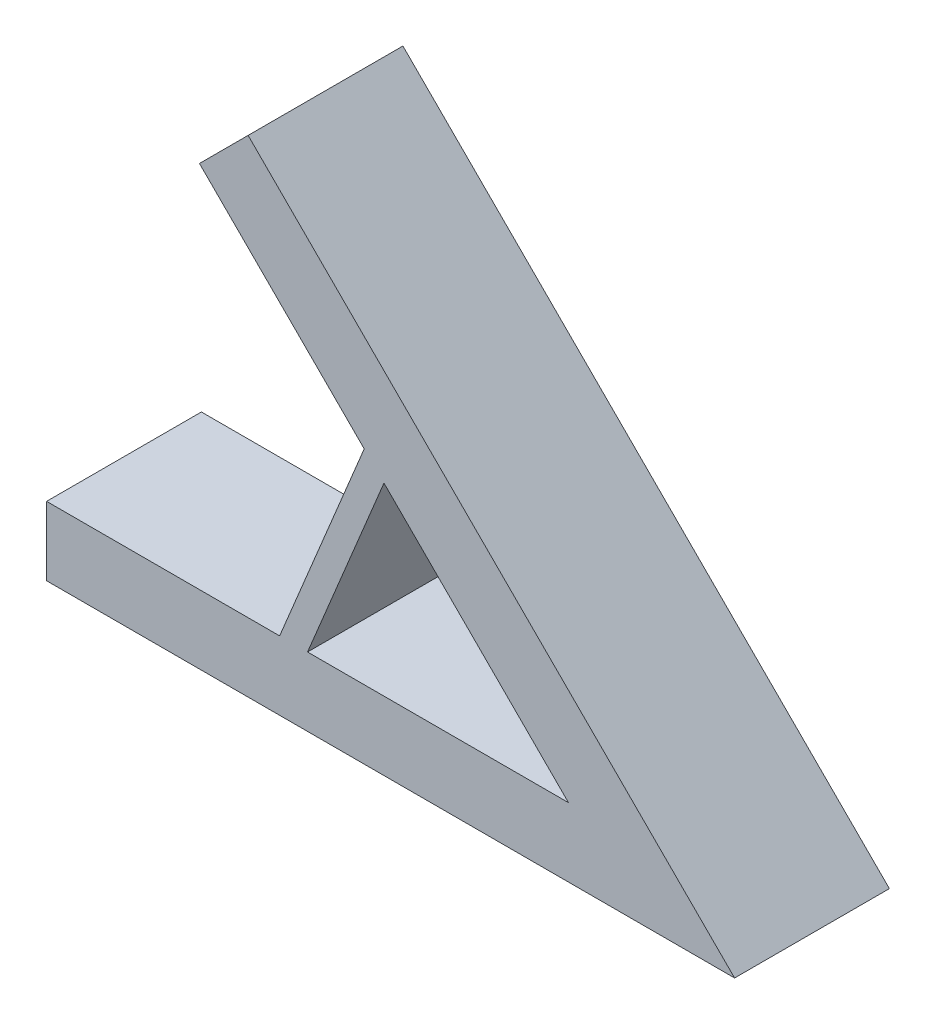
ISO-10303-21;
HEADER;
FILE_DESCRIPTION(('STEP AP214'),'2;1');
FILE_NAME('part.step','',(''),(''),'','','');
FILE_SCHEMA(('AUTOMOTIVE_DESIGN { 1 0 10303 214 1 1 1 1 }'));
ENDSEC;
DATA;
#1=APPLICATION_CONTEXT('core data for automotive mechanical design processes');
#2=APPLICATION_PROTOCOL_DEFINITION('international standard','automotive_design',2000,#1);
#3=PRODUCT_CONTEXT('',#1,'mechanical');
#4=PRODUCT('Part','Part','',(#3));
#5=PRODUCT_RELATED_PRODUCT_CATEGORY('part','',(#4));
#6=PRODUCT_DEFINITION_FORMATION('','',#4);
#7=PRODUCT_DEFINITION_CONTEXT('part definition',#1,'design');
#8=PRODUCT_DEFINITION('design','',#6,#7);
#9=PRODUCT_DEFINITION_SHAPE('','',#8);
#10=(LENGTH_UNIT() NAMED_UNIT(*) SI_UNIT(.MILLI.,.METRE.));
#11=(NAMED_UNIT(*) PLANE_ANGLE_UNIT() SI_UNIT($,.RADIAN.));
#12=(NAMED_UNIT(*) SI_UNIT($,.STERADIAN.) SOLID_ANGLE_UNIT());
#13=UNCERTAINTY_MEASURE_WITH_UNIT(LENGTH_MEASURE(1.E-05),#10,'distance_accuracy_value','');
#14=(GEOMETRIC_REPRESENTATION_CONTEXT(3) GLOBAL_UNCERTAINTY_ASSIGNED_CONTEXT((#13)) GLOBAL_UNIT_ASSIGNED_CONTEXT((#10,
#11,#12)) REPRESENTATION_CONTEXT('',''));
#15=CARTESIAN_POINT('',(0.,0.,0.));
#16=DIRECTION('',(0.,0.,1.));
#17=DIRECTION('',(1.,0.,0.));
#18=AXIS2_PLACEMENT_3D('',#15,#16,#17);
#19=CARTESIAN_POINT('',(0.,8.00000000000001,18.));
#20=DIRECTION('',(0.,-1.,0.));
#21=DIRECTION('',(1.,0.,0.));
#22=AXIS2_PLACEMENT_3D('',#19,#20,#21);
#23=PLANE('',#22);
#24=DIRECTION('',(-1.,0.,0.));
#25=VECTOR('',#24,1.);
#26=CARTESIAN_POINT('',(0.,8.00000000000001,0.));
#27=LINE('',#26,#25);
#28=CARTESIAN_POINT('',(-19.3137084989849,8.00000000000002,0.));
#29=VERTEX_POINT('',#28);
#30=CARTESIAN_POINT('',(-49.6568542494924,8.00000000000001,0.));
#31=VERTEX_POINT('',#30);
#32=EDGE_CURVE('E134',#29,#31,#27,.T.);
#33=ORIENTED_EDGE('',*,*,#32,.T.);
#34=DIRECTION('',(0.,0.,-1.));
#35=VECTOR('',#34,1.);
#36=CARTESIAN_POINT('',(-49.6568542494924,8.00000000000001,18.));
#37=LINE('',#36,#35);
#38=CARTESIAN_POINT('',(-49.6568542494924,8.00000000000001,18.));
#39=VERTEX_POINT('',#38);
#40=EDGE_CURVE('E11',#39,#31,#37,.T.);
#41=ORIENTED_EDGE('',*,*,#40,.F.);
#42=DIRECTION('',(-1.,0.,0.));
#43=VECTOR('',#42,1.);
#44=CARTESIAN_POINT('',(0.,8.00000000000001,18.));
#45=LINE('',#44,#43);
#46=CARTESIAN_POINT('',(-19.3137084989849,8.00000000000002,18.));
#47=VERTEX_POINT('',#46);
#48=EDGE_CURVE('E126',#47,#39,#45,.T.);
#49=ORIENTED_EDGE('',*,*,#48,.F.);
#50=DIRECTION('',(0.,0.,-1.));
#51=VECTOR('',#50,1.);
#52=CARTESIAN_POINT('',(-19.3137084989849,8.00000000000002,18.));
#53=LINE('',#52,#51);
#54=EDGE_CURVE('E135',#47,#29,#53,.T.);
#55=ORIENTED_EDGE('',*,*,#54,.T.);
#56=EDGE_LOOP('',(#33,#41,#49,#55));
#57=FACE_BOUND('',#56,.T.);
#58=ADVANCED_FACE('F36',(#57),#23,.F.);
#59=CARTESIAN_POINT('',(-45.2132034355966,18.7279220613578,18.));
#60=DIRECTION('',(-0.923879532511288,0.382683432365087,0.));
#61=DIRECTION('',(-0.382683432365087,-0.923879532511288,0.));
#62=AXIS2_PLACEMENT_3D('',#59,#60,#61);
#63=PLANE('',#62);
#64=DIRECTION('',(0.382683432365087,0.923879532511288,0.));
#65=VECTOR('',#64,1.);
#66=CARTESIAN_POINT('',(-45.2132034355966,18.7279220613578,0.));
#67=LINE('',#66,#65);
#68=CARTESIAN_POINT('',(-40.7695526217007,29.4558441227155,0.));
#69=VERTEX_POINT('',#68);
#70=EDGE_CURVE('E88',#31,#69,#67,.T.);
#71=ORIENTED_EDGE('',*,*,#70,.T.);
#72=DIRECTION('',(0.,0.,-1.));
#73=VECTOR('',#72,1.);
#74=CARTESIAN_POINT('',(-40.7695526217007,29.4558441227155,18.));
#75=LINE('',#74,#73);
#76=CARTESIAN_POINT('',(-40.7695526217007,29.4558441227155,18.));
#77=VERTEX_POINT('',#76);
#78=EDGE_CURVE('E46',#77,#69,#75,.T.);
#79=ORIENTED_EDGE('',*,*,#78,.F.);
#80=DIRECTION('',(0.382683432365087,0.923879532511288,0.));
#81=VECTOR('',#80,1.);
#82=CARTESIAN_POINT('',(-45.2132034355966,18.7279220613578,18.));
#83=LINE('',#82,#81);
#84=EDGE_CURVE('E122',#39,#77,#83,.T.);
#85=ORIENTED_EDGE('',*,*,#84,.F.);
#86=ORIENTED_EDGE('',*,*,#40,.T.);
#87=EDGE_LOOP('',(#71,#79,#85,#86));
#88=FACE_BOUND('',#87,.T.);
#89=ADVANCED_FACE('F123',(#88),#63,.F.);
#90=CARTESIAN_POINT('',(-47.9848420331304,19.875972358453,18.));
#91=DIRECTION('',(0.923879532511288,-0.382683432365087,0.));
#92=DIRECTION('',(0.382683432365087,0.923879532511288,0.));
#93=AXIS2_PLACEMENT_3D('',#90,#91,#92);
#94=PLANE('',#93);
#95=DIRECTION('',(-0.382683432365087,-0.923879532511288,0.));
#96=VECTOR('',#95,1.);
#97=CARTESIAN_POINT('',(-47.9848420331304,19.875972358453,0.));
#98=LINE('',#97,#96);
#99=CARTESIAN_POINT('',(-43.0656532158912,31.7519447169061,0.));
#100=VERTEX_POINT('',#99);
#101=CARTESIAN_POINT('',(-52.9040308503696,8.00000000000001,0.));
#102=VERTEX_POINT('',#101);
#103=EDGE_CURVE('E146',#100,#102,#98,.T.);
#104=ORIENTED_EDGE('',*,*,#103,.T.);
#105=DIRECTION('',(0.,0.,-1.));
#106=VECTOR('',#105,1.);
#107=CARTESIAN_POINT('',(-52.9040308503696,8.00000000000001,18.));
#108=LINE('',#107,#106);
#109=CARTESIAN_POINT('',(-52.9040308503696,8.00000000000001,18.));
#110=VERTEX_POINT('',#109);
#111=EDGE_CURVE('E40',#110,#102,#108,.T.);
#112=ORIENTED_EDGE('',*,*,#111,.F.);
#113=DIRECTION('',(-0.382683432365087,-0.923879532511288,0.));
#114=VECTOR('',#113,1.);
#115=CARTESIAN_POINT('',(-47.9848420331304,19.875972358453,18.));
#116=LINE('',#115,#114);
#117=CARTESIAN_POINT('',(-43.0656532158912,31.7519447169061,18.));
#118=VERTEX_POINT('',#117);
#119=EDGE_CURVE('E164',#118,#110,#116,.T.);
#120=ORIENTED_EDGE('',*,*,#119,.F.);
#121=DIRECTION('',(0.,0.,-1.));
#122=VECTOR('',#121,1.);
#123=CARTESIAN_POINT('',(-43.0656532158912,31.7519447169061,18.));
#124=LINE('',#123,#122);
#125=EDGE_CURVE('E172',#118,#100,#124,.T.);
#126=ORIENTED_EDGE('',*,*,#125,.T.);
#127=EDGE_LOOP('',(#104,#112,#120,#126));
#128=FACE_BOUND('',#127,.T.);
#129=ADVANCED_FACE('F38',(#128),#94,.F.);
#130=CARTESIAN_POINT('',(-80.,8.,0.));
#131=VERTEX_POINT('',#130);
#132=EDGE_CURVE('E139',#102,#131,#27,.T.);
#133=ORIENTED_EDGE('',*,*,#132,.T.);
#134=DIRECTION('',(0.,0.,-1.));
#135=VECTOR('',#134,1.);
#136=CARTESIAN_POINT('',(-80.,8.,18.));
#137=LINE('',#136,#135);
#138=CARTESIAN_POINT('',(-80.,8.,18.));
#139=VERTEX_POINT('',#138);
#140=EDGE_CURVE('E185',#139,#131,#137,.T.);
#141=ORIENTED_EDGE('',*,*,#140,.F.);
#142=EDGE_CURVE('E103',#110,#139,#45,.T.);
#143=ORIENTED_EDGE('',*,*,#142,.F.);
#144=ORIENTED_EDGE('',*,*,#111,.T.);
#145=EDGE_LOOP('',(#133,#141,#143,#144));
#146=FACE_BOUND('',#145,.T.);
#147=ADVANCED_FACE('F189',(#146),#23,.F.);
#148=CARTESIAN_POINT('',(-80.,0.,18.));
#149=DIRECTION('',(1.,0.,0.));
#150=DIRECTION('',(0.,0.,-1.));
#151=AXIS2_PLACEMENT_3D('',#148,#149,#150);
#152=PLANE('',#151);
#153=DIRECTION('',(0.,-1.,0.));
#154=VECTOR('',#153,1.);
#155=CARTESIAN_POINT('',(-80.,0.,0.));
#156=LINE('',#155,#154);
#157=CARTESIAN_POINT('',(-80.,0.,0.));
#158=VERTEX_POINT('',#157);
#159=EDGE_CURVE('E145',#131,#158,#156,.T.);
#160=ORIENTED_EDGE('',*,*,#159,.T.);
#161=DIRECTION('',(0.,0.,-1.));
#162=VECTOR('',#161,1.);
#163=CARTESIAN_POINT('',(-80.,0.,18.));
#164=LINE('',#163,#162);
#165=CARTESIAN_POINT('',(-80.,0.,18.));
#166=VERTEX_POINT('',#165);
#167=EDGE_CURVE('E183',#166,#158,#164,.T.);
#168=ORIENTED_EDGE('',*,*,#167,.F.);
#169=DIRECTION('',(0.,-1.,0.));
#170=VECTOR('',#169,1.);
#171=CARTESIAN_POINT('',(-80.,0.,18.));
#172=LINE('',#171,#170);
#173=EDGE_CURVE('E162',#139,#166,#172,.T.);
#174=ORIENTED_EDGE('',*,*,#173,.F.);
#175=ORIENTED_EDGE('',*,*,#140,.T.);
#176=EDGE_LOOP('',(#160,#168,#174,#175));
#177=FACE_BOUND('',#176,.T.);
#178=ADVANCED_FACE('F200',(#177),#152,.F.);
#179=CARTESIAN_POINT('',(0.,0.,18.));
#180=DIRECTION('',(0.,1.,0.));
#181=DIRECTION('',(0.,0.,1.));
#182=AXIS2_PLACEMENT_3D('',#179,#180,#181);
#183=PLANE('',#182);
#184=DIRECTION('',(1.,0.,0.));
#185=VECTOR('',#184,1.);
#186=CARTESIAN_POINT('',(0.,0.,0.));
#187=LINE('',#186,#185);
#188=CARTESIAN_POINT('',(0.,0.,0.));
#189=VERTEX_POINT('',#188);
#190=EDGE_CURVE('E148',#158,#189,#187,.T.);
#191=ORIENTED_EDGE('',*,*,#190,.T.);
#192=DIRECTION('',(0.,0.,-1.));
#193=VECTOR('',#192,1.);
#194=CARTESIAN_POINT('',(0.,0.,18.));
#195=LINE('',#194,#193);
#196=CARTESIAN_POINT('',(0.,0.,18.));
#197=VERTEX_POINT('',#196);
#198=EDGE_CURVE('E180',#197,#189,#195,.T.);
#199=ORIENTED_EDGE('',*,*,#198,.F.);
#200=DIRECTION('',(1.,0.,0.));
#201=VECTOR('',#200,1.);
#202=CARTESIAN_POINT('',(0.,0.,18.));
#203=LINE('',#202,#201);
#204=EDGE_CURVE('E160',#166,#197,#203,.T.);
#205=ORIENTED_EDGE('',*,*,#204,.F.);
#206=ORIENTED_EDGE('',*,*,#167,.T.);
#207=EDGE_LOOP('',(#191,#199,#205,#206));
#208=FACE_BOUND('',#207,.T.);
#209=ADVANCED_FACE('F203',(#208),#183,.F.);
#210=CARTESIAN_POINT('',(0.,0.,18.));
#211=DIRECTION('',(-0.707106781186544,-0.707106781186551,0.));
#212=DIRECTION('',(0.707106781186551,-0.707106781186544,0.));
#213=AXIS2_PLACEMENT_3D('',#210,#211,#212);
#214=PLANE('',#213);
#215=DIRECTION('',(-0.707106781186551,0.707106781186544,0.));
#216=VECTOR('',#215,1.);
#217=CARTESIAN_POINT('',(0.,0.,0.));
#218=LINE('',#217,#216);
#219=CARTESIAN_POINT('',(-56.5685424949241,56.5685424949235,0.));
#220=VERTEX_POINT('',#219);
#221=EDGE_CURVE('E211',#189,#220,#218,.T.);
#222=ORIENTED_EDGE('',*,*,#221,.T.);
#223=DIRECTION('',(0.,0.,-1.));
#224=VECTOR('',#223,1.);
#225=CARTESIAN_POINT('',(-56.5685424949241,56.5685424949235,18.));
#226=LINE('',#225,#224);
#227=CARTESIAN_POINT('',(-56.5685424949241,56.5685424949235,18.));
#228=VERTEX_POINT('',#227);
#229=EDGE_CURVE('E177',#228,#220,#226,.T.);
#230=ORIENTED_EDGE('',*,*,#229,.F.);
#231=DIRECTION('',(-0.707106781186551,0.707106781186544,0.));
#232=VECTOR('',#231,1.);
#233=CARTESIAN_POINT('',(0.,0.,18.));
#234=LINE('',#233,#232);
#235=EDGE_CURVE('E158',#197,#228,#234,.T.);
#236=ORIENTED_EDGE('',*,*,#235,.F.);
#237=ORIENTED_EDGE('',*,*,#198,.T.);
#238=EDGE_LOOP('',(#222,#230,#236,#237));
#239=FACE_BOUND('',#238,.T.);
#240=ADVANCED_FACE('F210',(#239),#214,.F.);
#241=CARTESIAN_POINT('',(-56.5685424949241,56.5685424949235,18.));
#242=DIRECTION('',(0.707106781186551,-0.707106781186544,0.));
#243=DIRECTION('',(0.707106781186544,0.707106781186551,0.));
#244=AXIS2_PLACEMENT_3D('',#241,#242,#243);
#245=PLANE('',#244);
#246=DIRECTION('',(-0.707106781186544,-0.707106781186551,0.));
#247=VECTOR('',#246,1.);
#248=CARTESIAN_POINT('',(-56.5685424949241,56.5685424949235,0.));
#249=LINE('',#248,#247);
#250=CARTESIAN_POINT('',(-62.2253967444165,50.9116882454311,0.));
#251=VERTEX_POINT('',#250);
#252=EDGE_CURVE('E141',#220,#251,#249,.T.);
#253=ORIENTED_EDGE('',*,*,#252,.T.);
#254=DIRECTION('',(0.,0.,-1.));
#255=VECTOR('',#254,1.);
#256=CARTESIAN_POINT('',(-62.2253967444165,50.9116882454311,18.));
#257=LINE('',#256,#255);
#258=CARTESIAN_POINT('',(-62.2253967444165,50.9116882454311,18.));
#259=VERTEX_POINT('',#258);
#260=EDGE_CURVE('E174',#259,#251,#257,.T.);
#261=ORIENTED_EDGE('',*,*,#260,.F.);
#262=DIRECTION('',(-0.707106781186544,-0.707106781186551,0.));
#263=VECTOR('',#262,1.);
#264=CARTESIAN_POINT('',(-56.5685424949241,56.5685424949235,18.));
#265=LINE('',#264,#263);
#266=EDGE_CURVE('E156',#228,#259,#265,.T.);
#267=ORIENTED_EDGE('',*,*,#266,.F.);
#268=ORIENTED_EDGE('',*,*,#229,.T.);
#269=EDGE_LOOP('',(#253,#261,#267,#268));
#270=FACE_BOUND('',#269,.T.);
#271=ADVANCED_FACE('F213',(#270),#245,.F.);
#272=CARTESIAN_POINT('',(-5.65685424949232,-5.65685424949239,18.));
#273=DIRECTION('',(0.707106781186543,0.707106781186552,0.));
#274=DIRECTION('',(-0.707106781186552,0.707106781186543,0.));
#275=AXIS2_PLACEMENT_3D('',#272,#273,#274);
#276=PLANE('',#275);
#277=DIRECTION('',(0.707106781186552,-0.707106781186543,0.));
#278=VECTOR('',#277,1.);
#279=CARTESIAN_POINT('',(-5.65685424949232,-5.65685424949239,0.));
#280=LINE('',#279,#278);
#281=EDGE_CURVE('E137',#251,#100,#280,.T.);
#282=ORIENTED_EDGE('',*,*,#281,.T.);
#283=ORIENTED_EDGE('',*,*,#125,.F.);
#284=DIRECTION('',(0.707106781186552,-0.707106781186543,0.));
#285=VECTOR('',#284,1.);
#286=CARTESIAN_POINT('',(-5.65685424949232,-5.65685424949239,18.));
#287=LINE('',#286,#285);
#288=EDGE_CURVE('E131',#259,#118,#287,.T.);
#289=ORIENTED_EDGE('',*,*,#288,.F.);
#290=ORIENTED_EDGE('',*,*,#260,.T.);
#291=EDGE_LOOP('',(#282,#283,#289,#290));
#292=FACE_BOUND('',#291,.T.);
#293=ADVANCED_FACE('F214',(#292),#276,.F.);
#294=EDGE_CURVE('E94',#69,#29,#280,.T.);
#295=ORIENTED_EDGE('',*,*,#294,.T.);
#296=ORIENTED_EDGE('',*,*,#54,.F.);
#297=EDGE_CURVE('E55',#77,#47,#287,.T.);
#298=ORIENTED_EDGE('',*,*,#297,.F.);
#299=ORIENTED_EDGE('',*,*,#78,.T.);
#300=EDGE_LOOP('',(#295,#296,#298,#299));
#301=FACE_BOUND('',#300,.T.);
#302=ADVANCED_FACE('F216',(#301),#276,.F.);
#303=CARTESIAN_POINT('',(0.,0.,18.));
#304=DIRECTION('',(0.,0.,1.));
#305=DIRECTION('',(1.,0.,0.));
#306=AXIS2_PLACEMENT_3D('',#303,#304,#305);
#307=PLANE('',#306);
#308=ORIENTED_EDGE('',*,*,#119,.T.);
#309=ORIENTED_EDGE('',*,*,#142,.T.);
#310=ORIENTED_EDGE('',*,*,#173,.T.);
#311=ORIENTED_EDGE('',*,*,#204,.T.);
#312=ORIENTED_EDGE('',*,*,#235,.T.);
#313=ORIENTED_EDGE('',*,*,#266,.T.);
#314=ORIENTED_EDGE('',*,*,#288,.T.);
#315=EDGE_LOOP('',(#308,#309,#310,#311,#312,#313,#314));
#316=FACE_BOUND('',#315,.T.);
#317=ORIENTED_EDGE('',*,*,#48,.T.);
#318=ORIENTED_EDGE('',*,*,#84,.T.);
#319=ORIENTED_EDGE('',*,*,#297,.T.);
#320=EDGE_LOOP('',(#317,#318,#319));
#321=FACE_BOUND('',#320,.T.);
#322=ADVANCED_FACE('F129',(#316,#321),#307,.T.);
#323=CARTESIAN_POINT('',(0.,0.,0.));
#324=DIRECTION('',(0.,0.,1.));
#325=DIRECTION('',(1.,0.,0.));
#326=AXIS2_PLACEMENT_3D('',#323,#324,#325);
#327=PLANE('',#326);
#328=ORIENTED_EDGE('',*,*,#103,.F.);
#329=ORIENTED_EDGE('',*,*,#281,.F.);
#330=ORIENTED_EDGE('',*,*,#252,.F.);
#331=ORIENTED_EDGE('',*,*,#221,.F.);
#332=ORIENTED_EDGE('',*,*,#190,.F.);
#333=ORIENTED_EDGE('',*,*,#159,.F.);
#334=ORIENTED_EDGE('',*,*,#132,.F.);
#335=EDGE_LOOP('',(#328,#329,#330,#331,#332,#333,#334));
#336=FACE_BOUND('',#335,.T.);
#337=ORIENTED_EDGE('',*,*,#32,.F.);
#338=ORIENTED_EDGE('',*,*,#294,.F.);
#339=ORIENTED_EDGE('',*,*,#70,.F.);
#340=EDGE_LOOP('',(#337,#338,#339));
#341=FACE_BOUND('',#340,.T.);
#342=ADVANCED_FACE('F195',(#336,#341),#327,.F.);
#343=CLOSED_SHELL('',(#58,#89,#129,#147,#178,#209,#240,#271,#293,#302,#322,#342));
#344=MANIFOLD_SOLID_BREP('B2',#343);
#345=ADVANCED_BREP_SHAPE_REPRESENTATION('',(#18,#344),#14);
#346=SHAPE_DEFINITION_REPRESENTATION(#9,#345);
ENDSEC;
END-ISO-10303-21;
